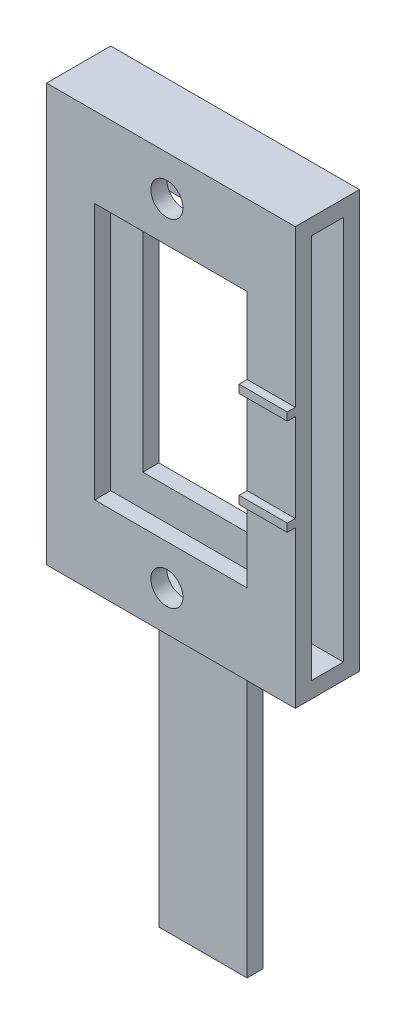
ISO-10303-21;
HEADER;
FILE_DESCRIPTION(('STEP AP214'),'2;1');
FILE_NAME('part.step','',(''),(''),'','','');
FILE_SCHEMA(('AUTOMOTIVE_DESIGN { 1 0 10303 214 1 1 1 1 }'));
ENDSEC;
DATA;
#1=APPLICATION_CONTEXT('core data for automotive mechanical design processes');
#2=APPLICATION_PROTOCOL_DEFINITION('international standard','automotive_design',2000,#1);
#3=PRODUCT_CONTEXT('',#1,'mechanical');
#4=PRODUCT('Part','Part','',(#3));
#5=PRODUCT_RELATED_PRODUCT_CATEGORY('part','',(#4));
#6=PRODUCT_DEFINITION_FORMATION('','',#4);
#7=PRODUCT_DEFINITION_CONTEXT('part definition',#1,'design');
#8=PRODUCT_DEFINITION('design','',#6,#7);
#9=PRODUCT_DEFINITION_SHAPE('','',#8);
#10=(LENGTH_UNIT() NAMED_UNIT(*) SI_UNIT(.MILLI.,.METRE.));
#11=(NAMED_UNIT(*) PLANE_ANGLE_UNIT() SI_UNIT($,.RADIAN.));
#12=(NAMED_UNIT(*) SI_UNIT($,.STERADIAN.) SOLID_ANGLE_UNIT());
#13=UNCERTAINTY_MEASURE_WITH_UNIT(LENGTH_MEASURE(1.E-05),#10,'distance_accuracy_value','');
#14=(GEOMETRIC_REPRESENTATION_CONTEXT(3) GLOBAL_UNCERTAINTY_ASSIGNED_CONTEXT((#13)) GLOBAL_UNIT_ASSIGNED_CONTEXT((#10,
#11,#12)) REPRESENTATION_CONTEXT('',''));
#15=CARTESIAN_POINT('',(0.,0.,0.));
#16=DIRECTION('',(0.,0.,1.));
#17=DIRECTION('',(1.,0.,0.));
#18=AXIS2_PLACEMENT_3D('',#15,#16,#17);
#19=CARTESIAN_POINT('',(0.,0.,3.));
#20=DIRECTION('',(0.,0.,1.));
#21=DIRECTION('',(1.,0.,0.));
#22=AXIS2_PLACEMENT_3D('',#19,#20,#21);
#23=PLANE('',#22);
#24=DIRECTION('',(0.,1.,0.));
#25=VECTOR('',#24,1.);
#26=CARTESIAN_POINT('',(4.75,19.4,3.));
#27=LINE('',#26,#25);
#28=CARTESIAN_POINT('',(4.75,8.65,3.));
#29=VERTEX_POINT('',#28);
#30=CARTESIAN_POINT('',(4.75,14.15,3.));
#31=VERTEX_POINT('',#30);
#32=EDGE_CURVE('E293',#29,#31,#27,.T.);
#33=ORIENTED_EDGE('',*,*,#32,.F.);
#34=DIRECTION('',(-1.,0.,0.));
#35=VECTOR('',#34,1.);
#36=CARTESIAN_POINT('',(4.75,8.65,3.));
#37=LINE('',#36,#35);
#38=CARTESIAN_POINT('',(7.75,8.65,3.));
#39=VERTEX_POINT('',#38);
#40=EDGE_CURVE('E487',#39,#29,#37,.T.);
#41=ORIENTED_EDGE('',*,*,#40,.F.);
#42=DIRECTION('',(0.,1.,0.));
#43=VECTOR('',#42,1.);
#44=CARTESIAN_POINT('',(7.75,-1.6,3.));
#45=LINE('',#44,#43);
#46=CARTESIAN_POINT('',(7.75,14.15,3.));
#47=VERTEX_POINT('',#46);
#48=EDGE_CURVE('E241',#39,#47,#45,.T.);
#49=ORIENTED_EDGE('',*,*,#48,.T.);
#50=DIRECTION('',(1.,0.,0.));
#51=VECTOR('',#50,1.);
#52=CARTESIAN_POINT('',(4.75,14.15,3.));
#53=LINE('',#52,#51);
#54=EDGE_CURVE('E243',#31,#47,#53,.T.);
#55=ORIENTED_EDGE('',*,*,#54,.F.);
#56=EDGE_LOOP('',(#33,#41,#49,#55));
#57=FACE_BOUND('',#56,.T.);
#58=ADVANCED_FACE('F33',(#57),#23,.T.);
#59=CARTESIAN_POINT('',(-0.25,21.9,3.));
#60=DIRECTION('',(0.,0.,1.));
#61=DIRECTION('',(1.,0.,0.));
#62=AXIS2_PLACEMENT_3D('',#59,#60,#61);
#63=CIRCLE('',#62,0.999999999999999);
#64=CARTESIAN_POINT('',(0.749999999999999,21.9,3.));
#65=VERTEX_POINT('',#64);
#66=EDGE_CURVE('E271',#65,#65,#63,.T.);
#67=ORIENTED_EDGE('',*,*,#66,.F.);
#68=EDGE_LOOP('',(#67));
#69=FACE_BOUND('',#68,.T.);
#70=CARTESIAN_POINT('',(-0.25,0.899999999999998,3.));
#71=DIRECTION('',(0.,0.,1.));
#72=DIRECTION('',(1.,0.,0.));
#73=AXIS2_PLACEMENT_3D('',#70,#71,#72);
#74=CIRCLE('',#73,0.999999999999999);
#75=CARTESIAN_POINT('',(0.749999999999999,0.899999999999998,3.));
#76=VERTEX_POINT('',#75);
#77=EDGE_CURVE('E277',#76,#76,#74,.T.);
#78=ORIENTED_EDGE('',*,*,#77,.F.);
#79=EDGE_LOOP('',(#78));
#80=FACE_BOUND('',#79,.T.);
#81=CARTESIAN_POINT('',(7.75,-1.6,3.));
#82=VERTEX_POINT('',#81);
#83=CARTESIAN_POINT('',(7.75,8.15,3.));
#84=VERTEX_POINT('',#83);
#85=EDGE_CURVE('E366',#82,#84,#45,.T.);
#86=ORIENTED_EDGE('',*,*,#85,.T.);
#87=DIRECTION('',(1.,0.,0.));
#88=VECTOR('',#87,1.);
#89=CARTESIAN_POINT('',(4.75,8.15,3.));
#90=LINE('',#89,#88);
#91=CARTESIAN_POINT('',(4.75,8.15,3.));
#92=VERTEX_POINT('',#91);
#93=EDGE_CURVE('E234',#92,#84,#90,.T.);
#94=ORIENTED_EDGE('',*,*,#93,.F.);
#95=CARTESIAN_POINT('',(4.75,3.4,3.));
#96=VERTEX_POINT('',#95);
#97=EDGE_CURVE('E289',#96,#92,#27,.T.);
#98=ORIENTED_EDGE('',*,*,#97,.F.);
#99=DIRECTION('',(1.,0.,0.));
#100=VECTOR('',#99,1.);
#101=CARTESIAN_POINT('',(-4.75,3.4,3.));
#102=LINE('',#101,#100);
#103=CARTESIAN_POINT('',(-4.75,3.4,3.));
#104=VERTEX_POINT('',#103);
#105=EDGE_CURVE('E285',#104,#96,#102,.T.);
#106=ORIENTED_EDGE('',*,*,#105,.F.);
#107=DIRECTION('',(0.,-1.,0.));
#108=VECTOR('',#107,1.);
#109=CARTESIAN_POINT('',(-4.75,19.4,3.));
#110=LINE('',#109,#108);
#111=CARTESIAN_POINT('',(-4.75,19.4,3.));
#112=VERTEX_POINT('',#111);
#113=EDGE_CURVE('E283',#112,#104,#110,.T.);
#114=ORIENTED_EDGE('',*,*,#113,.F.);
#115=DIRECTION('',(-1.,0.,0.));
#116=VECTOR('',#115,1.);
#117=CARTESIAN_POINT('',(-4.75,19.4,3.));
#118=LINE('',#117,#116);
#119=CARTESIAN_POINT('',(4.75,19.4,3.));
#120=VERTEX_POINT('',#119);
#121=EDGE_CURVE('E292',#120,#112,#118,.T.);
#122=ORIENTED_EDGE('',*,*,#121,.F.);
#123=CARTESIAN_POINT('',(4.75,14.65,3.));
#124=VERTEX_POINT('',#123);
#125=EDGE_CURVE('E288',#124,#120,#27,.T.);
#126=ORIENTED_EDGE('',*,*,#125,.F.);
#127=DIRECTION('',(-1.,0.,0.));
#128=VECTOR('',#127,1.);
#129=CARTESIAN_POINT('',(4.75,14.65,3.));
#130=LINE('',#129,#128);
#131=CARTESIAN_POINT('',(7.75,14.65,3.));
#132=VERTEX_POINT('',#131);
#133=EDGE_CURVE('E56',#132,#124,#130,.T.);
#134=ORIENTED_EDGE('',*,*,#133,.F.);
#135=CARTESIAN_POINT('',(7.75,24.4,3.));
#136=VERTEX_POINT('',#135);
#137=EDGE_CURVE('E351',#132,#136,#45,.T.);
#138=ORIENTED_EDGE('',*,*,#137,.T.);
#139=DIRECTION('',(-1.,0.,0.));
#140=VECTOR('',#139,1.);
#141=CARTESIAN_POINT('',(7.75,24.4,3.));
#142=LINE('',#141,#140);
#143=CARTESIAN_POINT('',(-7.75,24.4,3.));
#144=VERTEX_POINT('',#143);
#145=EDGE_CURVE('E369',#136,#144,#142,.T.);
#146=ORIENTED_EDGE('',*,*,#145,.T.);
#147=DIRECTION('',(0.,-1.,0.));
#148=VECTOR('',#147,1.);
#149=CARTESIAN_POINT('',(-7.75,-1.6,3.));
#150=LINE('',#149,#148);
#151=CARTESIAN_POINT('',(-7.75,-1.6,3.));
#152=VERTEX_POINT('',#151);
#153=EDGE_CURVE('E372',#144,#152,#150,.T.);
#154=ORIENTED_EDGE('',*,*,#153,.T.);
#155=DIRECTION('',(1.,0.,0.));
#156=VECTOR('',#155,1.);
#157=CARTESIAN_POINT('',(7.75,-1.6,3.));
#158=LINE('',#157,#156);
#159=EDGE_CURVE('E356',#152,#82,#158,.T.);
#160=ORIENTED_EDGE('',*,*,#159,.T.);
#161=EDGE_LOOP('',(#86,#94,#98,#106,#114,#122,#126,#134,#138,#146,#154,#160));
#162=FACE_BOUND('',#161,.T.);
#163=ADVANCED_FACE('F499',(#69,#80,#162),#23,.T.);
#164=CARTESIAN_POINT('',(7.75,-1.6,-1.));
#165=DIRECTION('',(1.,0.,0.));
#166=DIRECTION('',(0.,0.,-1.));
#167=AXIS2_PLACEMENT_3D('',#164,#165,#166);
#168=PLANE('',#167);
#169=ORIENTED_EDGE('',*,*,#85,.F.);
#170=DIRECTION('',(0.,0.,1.));
#171=VECTOR('',#170,1.);
#172=CARTESIAN_POINT('',(7.75,-1.6,-1.));
#173=LINE('',#172,#171);
#174=CARTESIAN_POINT('',(7.75,-1.6,-1.));
#175=VERTEX_POINT('',#174);
#176=EDGE_CURVE('E377',#175,#82,#173,.T.);
#177=ORIENTED_EDGE('',*,*,#176,.F.);
#178=DIRECTION('',(0.,1.,0.));
#179=VECTOR('',#178,1.);
#180=CARTESIAN_POINT('',(7.75,-1.6,-1.));
#181=LINE('',#180,#179);
#182=CARTESIAN_POINT('',(7.75,24.4,-1.));
#183=VERTEX_POINT('',#182);
#184=EDGE_CURVE('E352',#175,#183,#181,.T.);
#185=ORIENTED_EDGE('',*,*,#184,.T.);
#186=DIRECTION('',(0.,0.,1.));
#187=VECTOR('',#186,1.);
#188=CARTESIAN_POINT('',(7.75,24.4,-1.));
#189=LINE('',#188,#187);
#190=EDGE_CURVE('E365',#183,#136,#189,.T.);
#191=ORIENTED_EDGE('',*,*,#190,.T.);
#192=ORIENTED_EDGE('',*,*,#137,.F.);
#193=DIRECTION('',(0.,0.,-1.));
#194=VECTOR('',#193,1.);
#195=CARTESIAN_POINT('',(7.75,14.65,3.5));
#196=LINE('',#195,#194);
#197=CARTESIAN_POINT('',(7.75,14.65,3.5));
#198=VERTEX_POINT('',#197);
#199=EDGE_CURVE('E268',#198,#132,#196,.T.);
#200=ORIENTED_EDGE('',*,*,#199,.F.);
#201=DIRECTION('',(0.,1.,0.));
#202=VECTOR('',#201,1.);
#203=CARTESIAN_POINT('',(7.75,14.65,3.5));
#204=LINE('',#203,#202);
#205=CARTESIAN_POINT('',(7.75,14.15,3.5));
#206=VERTEX_POINT('',#205);
#207=EDGE_CURVE('E249',#206,#198,#204,.T.);
#208=ORIENTED_EDGE('',*,*,#207,.F.);
#209=DIRECTION('',(0.,0.,-1.));
#210=VECTOR('',#209,1.);
#211=CARTESIAN_POINT('',(7.75,14.15,3.5));
#212=LINE('',#211,#210);
#213=EDGE_CURVE('E257',#206,#47,#212,.T.);
#214=ORIENTED_EDGE('',*,*,#213,.T.);
#215=ORIENTED_EDGE('',*,*,#48,.F.);
#216=DIRECTION('',(0.,0.,-1.));
#217=VECTOR('',#216,1.);
#218=CARTESIAN_POINT('',(7.75,8.65,3.5));
#219=LINE('',#218,#217);
#220=CARTESIAN_POINT('',(7.75,8.65,3.5));
#221=VERTEX_POINT('',#220);
#222=EDGE_CURVE('E221',#221,#39,#219,.T.);
#223=ORIENTED_EDGE('',*,*,#222,.F.);
#224=DIRECTION('',(0.,1.,0.));
#225=VECTOR('',#224,1.);
#226=CARTESIAN_POINT('',(7.75,8.65,3.5));
#227=LINE('',#226,#225);
#228=CARTESIAN_POINT('',(7.75,8.15,3.5));
#229=VERTEX_POINT('',#228);
#230=EDGE_CURVE('E225',#229,#221,#227,.T.);
#231=ORIENTED_EDGE('',*,*,#230,.F.);
#232=DIRECTION('',(0.,0.,-1.));
#233=VECTOR('',#232,1.);
#234=CARTESIAN_POINT('',(7.75,8.15,3.5));
#235=LINE('',#234,#233);
#236=EDGE_CURVE('E493',#229,#84,#235,.T.);
#237=ORIENTED_EDGE('',*,*,#236,.T.);
#238=EDGE_LOOP('',(#169,#177,#185,#191,#192,#200,#208,#214,#215,#223,#231,#237));
#239=FACE_BOUND('',#238,.T.);
#240=DIRECTION('',(0.,0.,1.));
#241=VECTOR('',#240,1.);
#242=CARTESIAN_POINT('',(7.75,-0.600000000000002,-1.));
#243=LINE('',#242,#241);
#244=CARTESIAN_POINT('',(7.75,-0.600000000000002,0.));
#245=VERTEX_POINT('',#244);
#246=CARTESIAN_POINT('',(7.75,-0.600000000000002,2.));
#247=VERTEX_POINT('',#246);
#248=EDGE_CURVE('E422',#245,#247,#243,.T.);
#249=ORIENTED_EDGE('',*,*,#248,.T.);
#250=DIRECTION('',(0.,1.,0.));
#251=VECTOR('',#250,1.);
#252=CARTESIAN_POINT('',(7.75,-1.6,2.));
#253=LINE('',#252,#251);
#254=CARTESIAN_POINT('',(7.75,23.4,2.));
#255=VERTEX_POINT('',#254);
#256=EDGE_CURVE('E425',#247,#255,#253,.T.);
#257=ORIENTED_EDGE('',*,*,#256,.T.);
#258=DIRECTION('',(0.,0.,-1.));
#259=VECTOR('',#258,1.);
#260=CARTESIAN_POINT('',(7.75,23.4,-1.));
#261=LINE('',#260,#259);
#262=CARTESIAN_POINT('',(7.75,23.4,0.));
#263=VERTEX_POINT('',#262);
#264=EDGE_CURVE('E416',#255,#263,#261,.T.);
#265=ORIENTED_EDGE('',*,*,#264,.T.);
#266=DIRECTION('',(0.,-1.,0.));
#267=VECTOR('',#266,1.);
#268=CARTESIAN_POINT('',(7.75,-1.6,0.));
#269=LINE('',#268,#267);
#270=EDGE_CURVE('E419',#263,#245,#269,.T.);
#271=ORIENTED_EDGE('',*,*,#270,.T.);
#272=EDGE_LOOP('',(#249,#257,#265,#271));
#273=FACE_BOUND('',#272,.T.);
#274=ADVANCED_FACE('F238',(#239,#273),#168,.T.);
#275=CARTESIAN_POINT('',(7.75,-1.6,-1.));
#276=DIRECTION('',(0.,-1.,0.));
#277=DIRECTION('',(1.,0.,0.));
#278=AXIS2_PLACEMENT_3D('',#275,#276,#277);
#279=PLANE('',#278);
#280=DIRECTION('',(1.,0.,0.));
#281=VECTOR('',#280,1.);
#282=CARTESIAN_POINT('',(0.,-1.6,1.));
#283=LINE('',#282,#281);
#284=CARTESIAN_POINT('',(-2.75,-1.6,1.));
#285=VERTEX_POINT('',#284);
#286=CARTESIAN_POINT('',(2.75,-1.6,1.));
#287=VERTEX_POINT('',#286);
#288=EDGE_CURVE('E391',#285,#287,#283,.T.);
#289=ORIENTED_EDGE('',*,*,#288,.T.);
#290=DIRECTION('',(0.,0.,1.));
#291=VECTOR('',#290,1.);
#292=CARTESIAN_POINT('',(2.75,-1.6,1.));
#293=LINE('',#292,#291);
#294=CARTESIAN_POINT('',(2.75,-1.6,0.));
#295=VERTEX_POINT('',#294);
#296=EDGE_CURVE('E379',#295,#287,#293,.T.);
#297=ORIENTED_EDGE('',*,*,#296,.F.);
#298=DIRECTION('',(1.,0.,0.));
#299=VECTOR('',#298,1.);
#300=CARTESIAN_POINT('',(0.,-1.6,0.));
#301=LINE('',#300,#299);
#302=CARTESIAN_POINT('',(-2.75,-1.6,0.));
#303=VERTEX_POINT('',#302);
#304=EDGE_CURVE('E413',#303,#295,#301,.T.);
#305=ORIENTED_EDGE('',*,*,#304,.F.);
#306=DIRECTION('',(0.,0.,-1.));
#307=VECTOR('',#306,1.);
#308=CARTESIAN_POINT('',(-2.75,-1.6,1.));
#309=LINE('',#308,#307);
#310=EDGE_CURVE('E388',#285,#303,#309,.T.);
#311=ORIENTED_EDGE('',*,*,#310,.F.);
#312=EDGE_LOOP('',(#289,#297,#305,#311));
#313=FACE_BOUND('',#312,.T.);
#314=ORIENTED_EDGE('',*,*,#176,.T.);
#315=ORIENTED_EDGE('',*,*,#159,.F.);
#316=DIRECTION('',(0.,0.,1.));
#317=VECTOR('',#316,1.);
#318=CARTESIAN_POINT('',(-7.75,-1.6,-1.));
#319=LINE('',#318,#317);
#320=CARTESIAN_POINT('',(-7.75,-1.6,-1.));
#321=VERTEX_POINT('',#320);
#322=EDGE_CURVE('E380',#321,#152,#319,.T.);
#323=ORIENTED_EDGE('',*,*,#322,.F.);
#324=DIRECTION('',(1.,0.,0.));
#325=VECTOR('',#324,1.);
#326=CARTESIAN_POINT('',(7.75,-1.6,-1.));
#327=LINE('',#326,#325);
#328=EDGE_CURVE('E362',#321,#175,#327,.T.);
#329=ORIENTED_EDGE('',*,*,#328,.T.);
#330=EDGE_LOOP('',(#314,#315,#323,#329));
#331=FACE_BOUND('',#330,.T.);
#332=ADVANCED_FACE('F464',(#313,#331),#279,.T.);
#333=CARTESIAN_POINT('',(-7.75,-1.6,-1.));
#334=DIRECTION('',(-1.,0.,0.));
#335=DIRECTION('',(0.,-1.,0.));
#336=AXIS2_PLACEMENT_3D('',#333,#334,#335);
#337=PLANE('',#336);
#338=ORIENTED_EDGE('',*,*,#153,.F.);
#339=DIRECTION('',(0.,0.,1.));
#340=VECTOR('',#339,1.);
#341=CARTESIAN_POINT('',(-7.75,24.4,-1.));
#342=LINE('',#341,#340);
#343=CARTESIAN_POINT('',(-7.75,24.4,-1.));
#344=VERTEX_POINT('',#343);
#345=EDGE_CURVE('E382',#344,#144,#342,.T.);
#346=ORIENTED_EDGE('',*,*,#345,.F.);
#347=DIRECTION('',(0.,-1.,0.));
#348=VECTOR('',#347,1.);
#349=CARTESIAN_POINT('',(-7.75,-1.6,-1.));
#350=LINE('',#349,#348);
#351=EDGE_CURVE('E359',#344,#321,#350,.T.);
#352=ORIENTED_EDGE('',*,*,#351,.T.);
#353=ORIENTED_EDGE('',*,*,#322,.T.);
#354=EDGE_LOOP('',(#338,#346,#352,#353));
#355=FACE_BOUND('',#354,.T.);
#356=ADVANCED_FACE('F468',(#355),#337,.T.);
#357=CARTESIAN_POINT('',(7.75,24.4,-1.));
#358=DIRECTION('',(0.,1.,0.));
#359=DIRECTION('',(-1.,0.,0.));
#360=AXIS2_PLACEMENT_3D('',#357,#358,#359);
#361=PLANE('',#360);
#362=ORIENTED_EDGE('',*,*,#145,.F.);
#363=ORIENTED_EDGE('',*,*,#190,.F.);
#364=DIRECTION('',(-1.,0.,0.));
#365=VECTOR('',#364,1.);
#366=CARTESIAN_POINT('',(7.75,24.4,-1.));
#367=LINE('',#366,#365);
#368=EDGE_CURVE('E355',#183,#344,#367,.T.);
#369=ORIENTED_EDGE('',*,*,#368,.T.);
#370=ORIENTED_EDGE('',*,*,#345,.T.);
#371=EDGE_LOOP('',(#362,#363,#369,#370));
#372=FACE_BOUND('',#371,.T.);
#373=ADVANCED_FACE('F457',(#372),#361,.T.);
#374=CARTESIAN_POINT('',(0.,0.,-1.));
#375=DIRECTION('',(0.,0.,1.));
#376=DIRECTION('',(1.,0.,0.));
#377=AXIS2_PLACEMENT_3D('',#374,#375,#376);
#378=PLANE('',#377);
#379=DIRECTION('',(-1.,0.,0.));
#380=VECTOR('',#379,1.);
#381=CARTESIAN_POINT('',(0.,19.4,-1.));
#382=LINE('',#381,#380);
#383=CARTESIAN_POINT('',(4.75,19.4,-1.));
#384=VERTEX_POINT('',#383);
#385=CARTESIAN_POINT('',(-4.75,19.4,-1.));
#386=VERTEX_POINT('',#385);
#387=EDGE_CURVE('E323',#384,#386,#382,.T.);
#388=ORIENTED_EDGE('',*,*,#387,.T.);
#389=DIRECTION('',(0.,-1.,0.));
#390=VECTOR('',#389,1.);
#391=CARTESIAN_POINT('',(-4.75,0.,-1.));
#392=LINE('',#391,#390);
#393=CARTESIAN_POINT('',(-4.75,3.4,-1.));
#394=VERTEX_POINT('',#393);
#395=EDGE_CURVE('E328',#386,#394,#392,.T.);
#396=ORIENTED_EDGE('',*,*,#395,.T.);
#397=DIRECTION('',(1.,0.,0.));
#398=VECTOR('',#397,1.);
#399=CARTESIAN_POINT('',(0.,3.4,-1.));
#400=LINE('',#399,#398);
#401=CARTESIAN_POINT('',(4.75,3.4,-1.));
#402=VERTEX_POINT('',#401);
#403=EDGE_CURVE('E312',#394,#402,#400,.T.);
#404=ORIENTED_EDGE('',*,*,#403,.T.);
#405=DIRECTION('',(0.,1.,0.));
#406=VECTOR('',#405,1.);
#407=CARTESIAN_POINT('',(4.75,0.,-1.));
#408=LINE('',#407,#406);
#409=EDGE_CURVE('E318',#402,#384,#408,.T.);
#410=ORIENTED_EDGE('',*,*,#409,.T.);
#411=EDGE_LOOP('',(#388,#396,#404,#410));
#412=FACE_BOUND('',#411,.T.);
#413=ORIENTED_EDGE('',*,*,#184,.F.);
#414=ORIENTED_EDGE('',*,*,#328,.F.);
#415=ORIENTED_EDGE('',*,*,#351,.F.);
#416=ORIENTED_EDGE('',*,*,#368,.F.);
#417=EDGE_LOOP('',(#413,#414,#415,#416));
#418=FACE_BOUND('',#417,.T.);
#419=ADVANCED_FACE('F454',(#412,#418),#378,.F.);
#420=CARTESIAN_POINT('',(-2.75,-19.65,1.));
#421=DIRECTION('',(1.,0.,0.));
#422=DIRECTION('',(0.,0.,-1.));
#423=AXIS2_PLACEMENT_3D('',#420,#421,#422);
#424=PLANE('',#423);
#425=DIRECTION('',(0.,-1.,0.));
#426=VECTOR('',#425,1.);
#427=CARTESIAN_POINT('',(-2.75,-19.65,1.));
#428=LINE('',#427,#426);
#429=CARTESIAN_POINT('',(-2.75,-19.65,1.));
#430=VERTEX_POINT('',#429);
#431=EDGE_CURVE('E394',#285,#430,#428,.T.);
#432=ORIENTED_EDGE('',*,*,#431,.F.);
#433=ORIENTED_EDGE('',*,*,#310,.T.);
#434=DIRECTION('',(0.,-1.,0.));
#435=VECTOR('',#434,1.);
#436=CARTESIAN_POINT('',(-2.75,-19.65,0.));
#437=LINE('',#436,#435);
#438=CARTESIAN_POINT('',(-2.75,-19.65,0.));
#439=VERTEX_POINT('',#438);
#440=EDGE_CURVE('E393',#303,#439,#437,.T.);
#441=ORIENTED_EDGE('',*,*,#440,.T.);
#442=DIRECTION('',(0.,0.,-1.));
#443=VECTOR('',#442,1.);
#444=CARTESIAN_POINT('',(-2.75,-19.65,1.));
#445=LINE('',#444,#443);
#446=EDGE_CURVE('E410',#430,#439,#445,.T.);
#447=ORIENTED_EDGE('',*,*,#446,.F.);
#448=EDGE_LOOP('',(#432,#433,#441,#447));
#449=FACE_BOUND('',#448,.T.);
#450=ADVANCED_FACE('F35',(#449),#424,.F.);
#451=CARTESIAN_POINT('',(2.75,-19.65,1.));
#452=DIRECTION('',(0.,1.,0.));
#453=DIRECTION('',(0.,0.,1.));
#454=AXIS2_PLACEMENT_3D('',#451,#452,#453);
#455=PLANE('',#454);
#456=DIRECTION('',(1.,0.,0.));
#457=VECTOR('',#456,1.);
#458=CARTESIAN_POINT('',(2.75,-19.65,0.));
#459=LINE('',#458,#457);
#460=CARTESIAN_POINT('',(2.75,-19.65,0.));
#461=VERTEX_POINT('',#460);
#462=EDGE_CURVE('E404',#439,#461,#459,.T.);
#463=ORIENTED_EDGE('',*,*,#462,.T.);
#464=DIRECTION('',(0.,0.,-1.));
#465=VECTOR('',#464,1.);
#466=CARTESIAN_POINT('',(2.75,-19.65,1.));
#467=LINE('',#466,#465);
#468=CARTESIAN_POINT('',(2.75,-19.65,1.));
#469=VERTEX_POINT('',#468);
#470=EDGE_CURVE('E402',#469,#461,#467,.T.);
#471=ORIENTED_EDGE('',*,*,#470,.F.);
#472=DIRECTION('',(1.,0.,0.));
#473=VECTOR('',#472,1.);
#474=CARTESIAN_POINT('',(2.75,-19.65,1.));
#475=LINE('',#474,#473);
#476=EDGE_CURVE('E396',#430,#469,#475,.T.);
#477=ORIENTED_EDGE('',*,*,#476,.F.);
#478=ORIENTED_EDGE('',*,*,#446,.T.);
#479=EDGE_LOOP('',(#463,#471,#477,#478));
#480=FACE_BOUND('',#479,.T.);
#481=ADVANCED_FACE('F571',(#480),#455,.F.);
#482=CARTESIAN_POINT('',(2.75,-19.65,1.));
#483=DIRECTION('',(-1.,0.,0.));
#484=DIRECTION('',(0.,0.,1.));
#485=AXIS2_PLACEMENT_3D('',#482,#483,#484);
#486=PLANE('',#485);
#487=DIRECTION('',(0.,1.,0.));
#488=VECTOR('',#487,1.);
#489=CARTESIAN_POINT('',(2.75,-19.65,0.));
#490=LINE('',#489,#488);
#491=EDGE_CURVE('E397',#461,#295,#490,.T.);
#492=ORIENTED_EDGE('',*,*,#491,.T.);
#493=ORIENTED_EDGE('',*,*,#296,.T.);
#494=DIRECTION('',(0.,1.,0.));
#495=VECTOR('',#494,1.);
#496=CARTESIAN_POINT('',(2.75,-19.65,1.));
#497=LINE('',#496,#495);
#498=EDGE_CURVE('E399',#469,#287,#497,.T.);
#499=ORIENTED_EDGE('',*,*,#498,.F.);
#500=ORIENTED_EDGE('',*,*,#470,.T.);
#501=EDGE_LOOP('',(#492,#493,#499,#500));
#502=FACE_BOUND('',#501,.T.);
#503=ADVANCED_FACE('F565',(#502),#486,.F.);
#504=CARTESIAN_POINT('',(0.,0.,1.));
#505=DIRECTION('',(0.,0.,1.));
#506=DIRECTION('',(1.,0.,0.));
#507=AXIS2_PLACEMENT_3D('',#504,#505,#506);
#508=PLANE('',#507);
#509=ORIENTED_EDGE('',*,*,#288,.F.);
#510=ORIENTED_EDGE('',*,*,#431,.T.);
#511=ORIENTED_EDGE('',*,*,#476,.T.);
#512=ORIENTED_EDGE('',*,*,#498,.T.);
#513=EDGE_LOOP('',(#509,#510,#511,#512));
#514=FACE_BOUND('',#513,.T.);
#515=ADVANCED_FACE('F562',(#514),#508,.T.);
#516=CARTESIAN_POINT('',(0.,0.,0.));
#517=DIRECTION('',(0.,0.,1.));
#518=DIRECTION('',(1.,0.,0.));
#519=AXIS2_PLACEMENT_3D('',#516,#517,#518);
#520=PLANE('',#519);
#521=ORIENTED_EDGE('',*,*,#440,.F.);
#522=ORIENTED_EDGE('',*,*,#304,.T.);
#523=ORIENTED_EDGE('',*,*,#491,.F.);
#524=ORIENTED_EDGE('',*,*,#462,.F.);
#525=EDGE_LOOP('',(#521,#522,#523,#524));
#526=FACE_BOUND('',#525,.T.);
#527=ADVANCED_FACE('F522',(#526),#520,.F.);
#528=CARTESIAN_POINT('',(7.750012,23.4,2.));
#529=DIRECTION('',(0.,0.,-1.));
#530=DIRECTION('',(0.,1.,0.));
#531=AXIS2_PLACEMENT_3D('',#528,#529,#530);
#532=PLANE('',#531);
#533=CARTESIAN_POINT('',(-0.25,21.9,2.));
#534=DIRECTION('',(0.,0.,-1.));
#535=DIRECTION('',(0.,1.,0.));
#536=AXIS2_PLACEMENT_3D('',#533,#534,#535);
#537=CIRCLE('',#536,0.999999999999999);
#538=CARTESIAN_POINT('',(-0.25,22.9,2.));
#539=VERTEX_POINT('',#538);
#540=EDGE_CURVE('E274',#539,#539,#537,.T.);
#541=ORIENTED_EDGE('',*,*,#540,.F.);
#542=EDGE_LOOP('',(#541));
#543=FACE_BOUND('',#542,.T.);
#544=CARTESIAN_POINT('',(-0.25,0.899999999999998,2.));
#545=DIRECTION('',(0.,0.,-1.));
#546=DIRECTION('',(0.,1.,0.));
#547=AXIS2_PLACEMENT_3D('',#544,#545,#546);
#548=CIRCLE('',#547,0.999999999999999);
#549=CARTESIAN_POINT('',(-0.25,1.9,2.));
#550=VERTEX_POINT('',#549);
#551=EDGE_CURVE('E280',#550,#550,#548,.T.);
#552=ORIENTED_EDGE('',*,*,#551,.F.);
#553=EDGE_LOOP('',(#552));
#554=FACE_BOUND('',#553,.T.);
#555=DIRECTION('',(0.,1.,0.));
#556=VECTOR('',#555,1.);
#557=CARTESIAN_POINT('',(-4.75,23.4,2.));
#558=LINE('',#557,#556);
#559=CARTESIAN_POINT('',(-4.75,3.4,2.));
#560=VERTEX_POINT('',#559);
#561=CARTESIAN_POINT('',(-4.75,19.4,2.));
#562=VERTEX_POINT('',#561);
#563=EDGE_CURVE('E326',#560,#562,#558,.T.);
#564=ORIENTED_EDGE('',*,*,#563,.F.);
#565=DIRECTION('',(-1.,0.,0.));
#566=VECTOR('',#565,1.);
#567=CARTESIAN_POINT('',(7.750012,3.4,2.));
#568=LINE('',#567,#566);
#569=CARTESIAN_POINT('',(4.75,3.4,2.));
#570=VERTEX_POINT('',#569);
#571=EDGE_CURVE('E310',#570,#560,#568,.T.);
#572=ORIENTED_EDGE('',*,*,#571,.F.);
#573=DIRECTION('',(0.,-1.,0.));
#574=VECTOR('',#573,1.);
#575=CARTESIAN_POINT('',(4.75,23.4,2.));
#576=LINE('',#575,#574);
#577=CARTESIAN_POINT('',(4.75,19.4,2.));
#578=VERTEX_POINT('',#577);
#579=EDGE_CURVE('E315',#578,#570,#576,.T.);
#580=ORIENTED_EDGE('',*,*,#579,.F.);
#581=DIRECTION('',(1.,0.,0.));
#582=VECTOR('',#581,1.);
#583=CARTESIAN_POINT('',(7.750012,19.4,2.));
#584=LINE('',#583,#582);
#585=EDGE_CURVE('E321',#562,#578,#584,.T.);
#586=ORIENTED_EDGE('',*,*,#585,.F.);
#587=EDGE_LOOP('',(#564,#572,#580,#586));
#588=FACE_BOUND('',#587,.T.);
#589=DIRECTION('',(-1.,0.,0.));
#590=VECTOR('',#589,1.);
#591=CARTESIAN_POINT('',(7.750012,-0.600000000000002,2.));
#592=LINE('',#591,#590);
#593=CARTESIAN_POINT('',(-6.75,-0.600000000000002,2.));
#594=VERTEX_POINT('',#593);
#595=EDGE_CURVE('E349',#247,#594,#592,.T.);
#596=ORIENTED_EDGE('',*,*,#595,.T.);
#597=DIRECTION('',(0.,-1.,0.));
#598=VECTOR('',#597,1.);
#599=CARTESIAN_POINT('',(-6.75,23.4,2.));
#600=LINE('',#599,#598);
#601=CARTESIAN_POINT('',(-6.75,23.4,2.));
#602=VERTEX_POINT('',#601);
#603=EDGE_CURVE('E331',#602,#594,#600,.T.);
#604=ORIENTED_EDGE('',*,*,#603,.F.);
#605=DIRECTION('',(-1.,0.,0.));
#606=VECTOR('',#605,1.);
#607=CARTESIAN_POINT('',(7.750012,23.4,2.));
#608=LINE('',#607,#606);
#609=EDGE_CURVE('E343',#255,#602,#608,.T.);
#610=ORIENTED_EDGE('',*,*,#609,.F.);
#611=ORIENTED_EDGE('',*,*,#256,.F.);
#612=EDGE_LOOP('',(#596,#604,#610,#611));
#613=FACE_BOUND('',#612,.T.);
#614=ADVANCED_FACE('F518',(#543,#554,#588,#613),#532,.T.);
#615=CARTESIAN_POINT('',(7.750012,-0.600000000000002,2.));
#616=DIRECTION('',(0.,1.,0.));
#617=DIRECTION('',(0.,0.,1.));
#618=AXIS2_PLACEMENT_3D('',#615,#616,#617);
#619=PLANE('',#618);
#620=DIRECTION('',(-1.,0.,0.));
#621=VECTOR('',#620,1.);
#622=CARTESIAN_POINT('',(7.750012,-0.600000000000002,0.));
#623=LINE('',#622,#621);
#624=CARTESIAN_POINT('',(-6.75,-0.600000000000002,0.));
#625=VERTEX_POINT('',#624);
#626=EDGE_CURVE('E347',#245,#625,#623,.T.);
#627=ORIENTED_EDGE('',*,*,#626,.T.);
#628=DIRECTION('',(0.,0.,-1.));
#629=VECTOR('',#628,1.);
#630=CARTESIAN_POINT('',(-6.75,-0.600000000000002,2.));
#631=LINE('',#630,#629);
#632=EDGE_CURVE('E334',#594,#625,#631,.T.);
#633=ORIENTED_EDGE('',*,*,#632,.F.);
#634=ORIENTED_EDGE('',*,*,#595,.F.);
#635=ORIENTED_EDGE('',*,*,#248,.F.);
#636=EDGE_LOOP('',(#627,#633,#634,#635));
#637=FACE_BOUND('',#636,.T.);
#638=ADVANCED_FACE('F521',(#637),#619,.T.);
#639=CARTESIAN_POINT('',(7.750012,23.4,0.));
#640=DIRECTION('',(0.,0.,1.));
#641=DIRECTION('',(0.,-1.,0.));
#642=AXIS2_PLACEMENT_3D('',#639,#640,#641);
#643=PLANE('',#642);
#644=DIRECTION('',(0.,-1.,0.));
#645=VECTOR('',#644,1.);
#646=CARTESIAN_POINT('',(-4.75,23.4,0.));
#647=LINE('',#646,#645);
#648=CARTESIAN_POINT('',(-4.75,19.4,0.));
#649=VERTEX_POINT('',#648);
#650=CARTESIAN_POINT('',(-4.75,3.4,0.));
#651=VERTEX_POINT('',#650);
#652=EDGE_CURVE('E11',#649,#651,#647,.T.);
#653=ORIENTED_EDGE('',*,*,#652,.F.);
#654=DIRECTION('',(-1.,0.,0.));
#655=VECTOR('',#654,1.);
#656=CARTESIAN_POINT('',(7.750012,19.4,0.));
#657=LINE('',#656,#655);
#658=CARTESIAN_POINT('',(4.75,19.4,0.));
#659=VERTEX_POINT('',#658);
#660=EDGE_CURVE('E41',#659,#649,#657,.T.);
#661=ORIENTED_EDGE('',*,*,#660,.F.);
#662=DIRECTION('',(0.,1.,0.));
#663=VECTOR('',#662,1.);
#664=CARTESIAN_POINT('',(4.75,23.4,0.));
#665=LINE('',#664,#663);
#666=CARTESIAN_POINT('',(4.75,3.4,0.));
#667=VERTEX_POINT('',#666);
#668=EDGE_CURVE('E430',#667,#659,#665,.T.);
#669=ORIENTED_EDGE('',*,*,#668,.F.);
#670=DIRECTION('',(1.,0.,0.));
#671=VECTOR('',#670,1.);
#672=CARTESIAN_POINT('',(7.750012,3.4,0.));
#673=LINE('',#672,#671);
#674=EDGE_CURVE('E428',#651,#667,#673,.T.);
#675=ORIENTED_EDGE('',*,*,#674,.F.);
#676=EDGE_LOOP('',(#653,#661,#669,#675));
#677=FACE_BOUND('',#676,.T.);
#678=DIRECTION('',(-1.,0.,0.));
#679=VECTOR('',#678,1.);
#680=CARTESIAN_POINT('',(7.750012,23.4,0.));
#681=LINE('',#680,#679);
#682=CARTESIAN_POINT('',(-6.75,23.4,0.));
#683=VERTEX_POINT('',#682);
#684=EDGE_CURVE('E345',#263,#683,#681,.T.);
#685=ORIENTED_EDGE('',*,*,#684,.T.);
#686=DIRECTION('',(0.,1.,0.));
#687=VECTOR('',#686,1.);
#688=CARTESIAN_POINT('',(-6.75,23.4,0.));
#689=LINE('',#688,#687);
#690=EDGE_CURVE('E337',#625,#683,#689,.T.);
#691=ORIENTED_EDGE('',*,*,#690,.F.);
#692=ORIENTED_EDGE('',*,*,#626,.F.);
#693=ORIENTED_EDGE('',*,*,#270,.F.);
#694=EDGE_LOOP('',(#685,#691,#692,#693));
#695=FACE_BOUND('',#694,.T.);
#696=ADVANCED_FACE('F445',(#677,#695),#643,.T.);
#697=CARTESIAN_POINT('',(7.750012,23.4,2.));
#698=DIRECTION('',(0.,-1.,0.));
#699=DIRECTION('',(0.,0.,-1.));
#700=AXIS2_PLACEMENT_3D('',#697,#698,#699);
#701=PLANE('',#700);
#702=ORIENTED_EDGE('',*,*,#609,.T.);
#703=DIRECTION('',(0.,0.,1.));
#704=VECTOR('',#703,1.);
#705=CARTESIAN_POINT('',(-6.75,23.4,2.));
#706=LINE('',#705,#704);
#707=EDGE_CURVE('E340',#683,#602,#706,.T.);
#708=ORIENTED_EDGE('',*,*,#707,.F.);
#709=ORIENTED_EDGE('',*,*,#684,.F.);
#710=ORIENTED_EDGE('',*,*,#264,.F.);
#711=EDGE_LOOP('',(#702,#708,#709,#710));
#712=FACE_BOUND('',#711,.T.);
#713=ADVANCED_FACE('F536',(#712),#701,.T.);
#714=CARTESIAN_POINT('',(-6.75,0.,0.));
#715=DIRECTION('',(1.,0.,0.));
#716=DIRECTION('',(0.,0.,-1.));
#717=AXIS2_PLACEMENT_3D('',#714,#715,#716);
#718=PLANE('',#717);
#719=ORIENTED_EDGE('',*,*,#603,.T.);
#720=ORIENTED_EDGE('',*,*,#632,.T.);
#721=ORIENTED_EDGE('',*,*,#690,.T.);
#722=ORIENTED_EDGE('',*,*,#707,.T.);
#723=EDGE_LOOP('',(#719,#720,#721,#722));
#724=FACE_BOUND('',#723,.T.);
#725=ADVANCED_FACE('F533',(#724),#718,.T.);
#726=CARTESIAN_POINT('',(-4.75,3.4,-7.));
#727=DIRECTION('',(0.,-1.,0.));
#728=DIRECTION('',(0.,0.,-1.));
#729=AXIS2_PLACEMENT_3D('',#726,#727,#728);
#730=PLANE('',#729);
#731=DIRECTION('',(0.,0.,1.));
#732=VECTOR('',#731,1.);
#733=CARTESIAN_POINT('',(-4.75,3.4,-7.));
#734=LINE('',#733,#732);
#735=EDGE_CURVE('E307',#394,#651,#734,.T.);
#736=ORIENTED_EDGE('',*,*,#735,.T.);
#737=ORIENTED_EDGE('',*,*,#674,.T.);
#738=DIRECTION('',(0.,0.,1.));
#739=VECTOR('',#738,1.);
#740=CARTESIAN_POINT('',(4.75,3.4,-7.));
#741=LINE('',#740,#739);
#742=EDGE_CURVE('E304',#402,#667,#741,.T.);
#743=ORIENTED_EDGE('',*,*,#742,.F.);
#744=ORIENTED_EDGE('',*,*,#403,.F.);
#745=EDGE_LOOP('',(#736,#737,#743,#744));
#746=FACE_BOUND('',#745,.T.);
#747=ADVANCED_FACE('F449',(#746),#730,.F.);
#748=CARTESIAN_POINT('',(4.75,19.4,-7.));
#749=DIRECTION('',(1.,0.,0.));
#750=DIRECTION('',(0.,0.,-1.));
#751=AXIS2_PLACEMENT_3D('',#748,#749,#750);
#752=PLANE('',#751);
#753=ORIENTED_EDGE('',*,*,#742,.T.);
#754=ORIENTED_EDGE('',*,*,#668,.T.);
#755=DIRECTION('',(0.,0.,1.));
#756=VECTOR('',#755,1.);
#757=CARTESIAN_POINT('',(4.75,19.4,-7.));
#758=LINE('',#757,#756);
#759=EDGE_CURVE('E300',#384,#659,#758,.T.);
#760=ORIENTED_EDGE('',*,*,#759,.F.);
#761=ORIENTED_EDGE('',*,*,#409,.F.);
#762=EDGE_LOOP('',(#753,#754,#760,#761));
#763=FACE_BOUND('',#762,.T.);
#764=ADVANCED_FACE('F452',(#763),#752,.F.);
#765=CARTESIAN_POINT('',(-4.75,19.4,-7.));
#766=DIRECTION('',(0.,1.,0.));
#767=DIRECTION('',(0.,0.,1.));
#768=AXIS2_PLACEMENT_3D('',#765,#766,#767);
#769=PLANE('',#768);
#770=ORIENTED_EDGE('',*,*,#759,.T.);
#771=ORIENTED_EDGE('',*,*,#660,.T.);
#772=DIRECTION('',(0.,0.,1.));
#773=VECTOR('',#772,1.);
#774=CARTESIAN_POINT('',(-4.75,19.4,-7.));
#775=LINE('',#774,#773);
#776=EDGE_CURVE('E299',#386,#649,#775,.T.);
#777=ORIENTED_EDGE('',*,*,#776,.F.);
#778=ORIENTED_EDGE('',*,*,#387,.F.);
#779=EDGE_LOOP('',(#770,#771,#777,#778));
#780=FACE_BOUND('',#779,.T.);
#781=ADVANCED_FACE('F436',(#780),#769,.F.);
#782=CARTESIAN_POINT('',(-4.75,19.4,-7.));
#783=DIRECTION('',(-1.,0.,0.));
#784=DIRECTION('',(0.,-1.,0.));
#785=AXIS2_PLACEMENT_3D('',#782,#783,#784);
#786=PLANE('',#785);
#787=ORIENTED_EDGE('',*,*,#776,.T.);
#788=ORIENTED_EDGE('',*,*,#652,.T.);
#789=ORIENTED_EDGE('',*,*,#735,.F.);
#790=ORIENTED_EDGE('',*,*,#395,.F.);
#791=EDGE_LOOP('',(#787,#788,#789,#790));
#792=FACE_BOUND('',#791,.T.);
#793=ADVANCED_FACE('F442',(#792),#786,.F.);
#794=ORIENTED_EDGE('',*,*,#563,.T.);
#795=EDGE_CURVE('E297',#562,#112,#775,.T.);
#796=ORIENTED_EDGE('',*,*,#795,.T.);
#797=ORIENTED_EDGE('',*,*,#113,.T.);
#798=EDGE_CURVE('E296',#560,#104,#734,.T.);
#799=ORIENTED_EDGE('',*,*,#798,.F.);
#800=EDGE_LOOP('',(#794,#796,#797,#799));
#801=FACE_BOUND('',#800,.T.);
#802=ADVANCED_FACE('F511',(#801),#786,.F.);
#803=ORIENTED_EDGE('',*,*,#585,.T.);
#804=EDGE_CURVE('E301',#578,#120,#758,.T.);
#805=ORIENTED_EDGE('',*,*,#804,.T.);
#806=ORIENTED_EDGE('',*,*,#121,.T.);
#807=ORIENTED_EDGE('',*,*,#795,.F.);
#808=EDGE_LOOP('',(#803,#805,#806,#807));
#809=FACE_BOUND('',#808,.T.);
#810=ADVANCED_FACE('F516',(#809),#769,.F.);
#811=ORIENTED_EDGE('',*,*,#579,.T.);
#812=EDGE_CURVE('E305',#570,#96,#741,.T.);
#813=ORIENTED_EDGE('',*,*,#812,.T.);
#814=ORIENTED_EDGE('',*,*,#97,.T.);
#815=DIRECTION('',(0.,0.,-1.));
#816=VECTOR('',#815,1.);
#817=CARTESIAN_POINT('',(4.75,8.15,3.5));
#818=LINE('',#817,#816);
#819=CARTESIAN_POINT('',(4.75,8.15,3.5));
#820=VERTEX_POINT('',#819);
#821=EDGE_CURVE('E245',#820,#92,#818,.T.);
#822=ORIENTED_EDGE('',*,*,#821,.F.);
#823=DIRECTION('',(0.,-1.,0.));
#824=VECTOR('',#823,1.);
#825=CARTESIAN_POINT('',(4.75,8.65,3.5));
#826=LINE('',#825,#824);
#827=CARTESIAN_POINT('',(4.75,8.65,3.5));
#828=VERTEX_POINT('',#827);
#829=EDGE_CURVE('E224',#828,#820,#826,.T.);
#830=ORIENTED_EDGE('',*,*,#829,.F.);
#831=DIRECTION('',(0.,0.,-1.));
#832=VECTOR('',#831,1.);
#833=CARTESIAN_POINT('',(4.75,8.65,3.5));
#834=LINE('',#833,#832);
#835=EDGE_CURVE('E48',#828,#29,#834,.T.);
#836=ORIENTED_EDGE('',*,*,#835,.T.);
#837=ORIENTED_EDGE('',*,*,#32,.T.);
#838=DIRECTION('',(0.,0.,-1.));
#839=VECTOR('',#838,1.);
#840=CARTESIAN_POINT('',(4.75,14.15,3.5));
#841=LINE('',#840,#839);
#842=CARTESIAN_POINT('',(4.75,14.15,3.5));
#843=VERTEX_POINT('',#842);
#844=EDGE_CURVE('E262',#843,#31,#841,.T.);
#845=ORIENTED_EDGE('',*,*,#844,.F.);
#846=DIRECTION('',(0.,-1.,0.));
#847=VECTOR('',#846,1.);
#848=CARTESIAN_POINT('',(4.75,14.65,3.5));
#849=LINE('',#848,#847);
#850=CARTESIAN_POINT('',(4.75,14.65,3.5));
#851=VERTEX_POINT('',#850);
#852=EDGE_CURVE('E254',#851,#843,#849,.T.);
#853=ORIENTED_EDGE('',*,*,#852,.F.);
#854=DIRECTION('',(0.,0.,-1.));
#855=VECTOR('',#854,1.);
#856=CARTESIAN_POINT('',(4.75,14.65,3.5));
#857=LINE('',#856,#855);
#858=EDGE_CURVE('E265',#851,#124,#857,.T.);
#859=ORIENTED_EDGE('',*,*,#858,.T.);
#860=ORIENTED_EDGE('',*,*,#125,.T.);
#861=ORIENTED_EDGE('',*,*,#804,.F.);
#862=EDGE_LOOP('',(#811,#813,#814,#822,#830,#836,#837,#845,#853,#859,#860,#861));
#863=FACE_BOUND('',#862,.T.);
#864=ADVANCED_FACE('F501',(#863),#752,.F.);
#865=ORIENTED_EDGE('',*,*,#571,.T.);
#866=ORIENTED_EDGE('',*,*,#798,.T.);
#867=ORIENTED_EDGE('',*,*,#105,.T.);
#868=ORIENTED_EDGE('',*,*,#812,.F.);
#869=EDGE_LOOP('',(#865,#866,#867,#868));
#870=FACE_BOUND('',#869,.T.);
#871=ADVANCED_FACE('F506',(#870),#730,.F.);
#872=CARTESIAN_POINT('',(-0.25,0.899999999999998,3.));
#873=DIRECTION('',(0.,0.,1.));
#874=DIRECTION('',(1.,0.,0.));
#875=AXIS2_PLACEMENT_3D('',#872,#873,#874);
#876=CYLINDRICAL_SURFACE('',#875,0.999999999999999);
#877=ORIENTED_EDGE('',*,*,#77,.T.);
#878=EDGE_LOOP('',(#877));
#879=FACE_BOUND('',#878,.T.);
#880=ORIENTED_EDGE('',*,*,#551,.T.);
#881=EDGE_LOOP('',(#880));
#882=FACE_BOUND('',#881,.T.);
#883=ADVANCED_FACE('F634',(#879,#882),#876,.F.);
#884=CARTESIAN_POINT('',(-0.25,21.9,3.));
#885=DIRECTION('',(0.,0.,1.));
#886=DIRECTION('',(1.,0.,0.));
#887=AXIS2_PLACEMENT_3D('',#884,#885,#886);
#888=CYLINDRICAL_SURFACE('',#887,0.999999999999999);
#889=ORIENTED_EDGE('',*,*,#66,.T.);
#890=EDGE_LOOP('',(#889));
#891=FACE_BOUND('',#890,.T.);
#892=ORIENTED_EDGE('',*,*,#540,.T.);
#893=EDGE_LOOP('',(#892));
#894=FACE_BOUND('',#893,.T.);
#895=ADVANCED_FACE('F630',(#891,#894),#888,.F.);
#896=CARTESIAN_POINT('',(4.75,14.65,3.5));
#897=DIRECTION('',(0.,-1.,0.));
#898=DIRECTION('',(0.,0.,-1.));
#899=AXIS2_PLACEMENT_3D('',#896,#897,#898);
#900=PLANE('',#899);
#901=ORIENTED_EDGE('',*,*,#133,.T.);
#902=ORIENTED_EDGE('',*,*,#858,.F.);
#903=DIRECTION('',(-1.,0.,0.));
#904=VECTOR('',#903,1.);
#905=CARTESIAN_POINT('',(4.75,14.65,3.5));
#906=LINE('',#905,#904);
#907=EDGE_CURVE('E252',#198,#851,#906,.T.);
#908=ORIENTED_EDGE('',*,*,#907,.F.);
#909=ORIENTED_EDGE('',*,*,#199,.T.);
#910=EDGE_LOOP('',(#901,#902,#908,#909));
#911=FACE_BOUND('',#910,.T.);
#912=ADVANCED_FACE('F474',(#911),#900,.F.);
#913=CARTESIAN_POINT('',(4.75,14.15,3.5));
#914=DIRECTION('',(0.,1.,0.));
#915=DIRECTION('',(0.,0.,1.));
#916=AXIS2_PLACEMENT_3D('',#913,#914,#915);
#917=PLANE('',#916);
#918=ORIENTED_EDGE('',*,*,#54,.T.);
#919=ORIENTED_EDGE('',*,*,#213,.F.);
#920=DIRECTION('',(1.,0.,0.));
#921=VECTOR('',#920,1.);
#922=CARTESIAN_POINT('',(4.75,14.15,3.5));
#923=LINE('',#922,#921);
#924=EDGE_CURVE('E256',#843,#206,#923,.T.);
#925=ORIENTED_EDGE('',*,*,#924,.F.);
#926=ORIENTED_EDGE('',*,*,#844,.T.);
#927=EDGE_LOOP('',(#918,#919,#925,#926));
#928=FACE_BOUND('',#927,.T.);
#929=ADVANCED_FACE('F482',(#928),#917,.F.);
#930=CARTESIAN_POINT('',(0.,0.,3.5));
#931=DIRECTION('',(0.,0.,1.));
#932=DIRECTION('',(1.,0.,0.));
#933=AXIS2_PLACEMENT_3D('',#930,#931,#932);
#934=PLANE('',#933);
#935=ORIENTED_EDGE('',*,*,#207,.T.);
#936=ORIENTED_EDGE('',*,*,#907,.T.);
#937=ORIENTED_EDGE('',*,*,#852,.T.);
#938=ORIENTED_EDGE('',*,*,#924,.T.);
#939=EDGE_LOOP('',(#935,#936,#937,#938));
#940=FACE_BOUND('',#939,.T.);
#941=ADVANCED_FACE('F478',(#940),#934,.T.);
#942=CARTESIAN_POINT('',(4.75,8.65,3.5));
#943=DIRECTION('',(0.,-1.,0.));
#944=DIRECTION('',(0.,0.,-1.));
#945=AXIS2_PLACEMENT_3D('',#942,#943,#944);
#946=PLANE('',#945);
#947=ORIENTED_EDGE('',*,*,#40,.T.);
#948=ORIENTED_EDGE('',*,*,#835,.F.);
#949=DIRECTION('',(-1.,0.,0.));
#950=VECTOR('',#949,1.);
#951=CARTESIAN_POINT('',(4.75,8.65,3.5));
#952=LINE('',#951,#950);
#953=EDGE_CURVE('E217',#221,#828,#952,.T.);
#954=ORIENTED_EDGE('',*,*,#953,.F.);
#955=ORIENTED_EDGE('',*,*,#222,.T.);
#956=EDGE_LOOP('',(#947,#948,#954,#955));
#957=FACE_BOUND('',#956,.T.);
#958=ADVANCED_FACE('F219',(#957),#946,.F.);
#959=CARTESIAN_POINT('',(4.75,8.15,3.5));
#960=DIRECTION('',(0.,1.,0.));
#961=DIRECTION('',(0.,0.,1.));
#962=AXIS2_PLACEMENT_3D('',#959,#960,#961);
#963=PLANE('',#962);
#964=ORIENTED_EDGE('',*,*,#93,.T.);
#965=ORIENTED_EDGE('',*,*,#236,.F.);
#966=DIRECTION('',(1.,0.,0.));
#967=VECTOR('',#966,1.);
#968=CARTESIAN_POINT('',(4.75,8.15,3.5));
#969=LINE('',#968,#967);
#970=EDGE_CURVE('E230',#820,#229,#969,.T.);
#971=ORIENTED_EDGE('',*,*,#970,.F.);
#972=ORIENTED_EDGE('',*,*,#821,.T.);
#973=EDGE_LOOP('',(#964,#965,#971,#972));
#974=FACE_BOUND('',#973,.T.);
#975=ADVANCED_FACE('F497',(#974),#963,.F.);
#976=CARTESIAN_POINT('',(0.,0.,3.5));
#977=DIRECTION('',(0.,0.,1.));
#978=DIRECTION('',(1.,0.,0.));
#979=AXIS2_PLACEMENT_3D('',#976,#977,#978);
#980=PLANE('',#979);
#981=ORIENTED_EDGE('',*,*,#230,.T.);
#982=ORIENTED_EDGE('',*,*,#953,.T.);
#983=ORIENTED_EDGE('',*,*,#829,.T.);
#984=ORIENTED_EDGE('',*,*,#970,.T.);
#985=EDGE_LOOP('',(#981,#982,#983,#984));
#986=FACE_BOUND('',#985,.T.);
#987=ADVANCED_FACE('F228',(#986),#980,.T.);
#988=CLOSED_SHELL('',(#58,#163,#274,#332,#356,#373,#419,#450,#481,#503,#515,#527,#614,#638,#696,
#713,#725,#747,#764,#781,#793,#802,#810,#864,#871,#883,#895,#912,#929,#941,#958,#975,#987));
#989=MANIFOLD_SOLID_BREP('B2',#988);
#990=ADVANCED_BREP_SHAPE_REPRESENTATION('',(#18,#989),#14);
#991=SHAPE_DEFINITION_REPRESENTATION(#9,#990);
ENDSEC;
END-ISO-10303-21;
